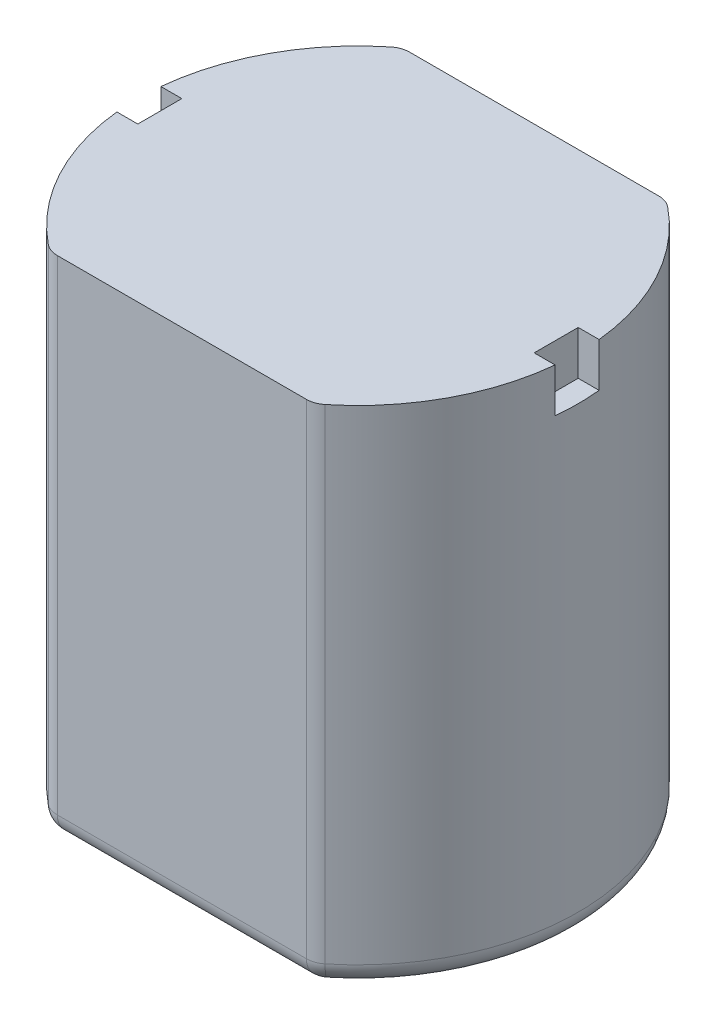
ISO-10303-21;
HEADER;
FILE_DESCRIPTION(('STEP AP214'),'2;1');
FILE_NAME('part.step','',(''),(''),'','','');
FILE_SCHEMA(('AUTOMOTIVE_DESIGN { 1 0 10303 214 1 1 1 1 }'));
ENDSEC;
DATA;
#1=APPLICATION_CONTEXT('core data for automotive mechanical design processes');
#2=APPLICATION_PROTOCOL_DEFINITION('international standard','automotive_design',2000,#1);
#3=PRODUCT_CONTEXT('',#1,'mechanical');
#4=PRODUCT('Part','Part','',(#3));
#5=PRODUCT_RELATED_PRODUCT_CATEGORY('part','',(#4));
#6=PRODUCT_DEFINITION_FORMATION('','',#4);
#7=PRODUCT_DEFINITION_CONTEXT('part definition',#1,'design');
#8=PRODUCT_DEFINITION('design','',#6,#7);
#9=PRODUCT_DEFINITION_SHAPE('','',#8);
#10=(LENGTH_UNIT() NAMED_UNIT(*) SI_UNIT(.MILLI.,.METRE.));
#11=(NAMED_UNIT(*) PLANE_ANGLE_UNIT() SI_UNIT($,.RADIAN.));
#12=(NAMED_UNIT(*) SI_UNIT($,.STERADIAN.) SOLID_ANGLE_UNIT());
#13=UNCERTAINTY_MEASURE_WITH_UNIT(LENGTH_MEASURE(1.E-05),#10,'distance_accuracy_value','');
#14=(GEOMETRIC_REPRESENTATION_CONTEXT(3) GLOBAL_UNCERTAINTY_ASSIGNED_CONTEXT((#13)) GLOBAL_UNIT_ASSIGNED_CONTEXT((#10,
#11,#12)) REPRESENTATION_CONTEXT('',''));
#15=CARTESIAN_POINT('',(0.,0.,0.));
#16=DIRECTION('',(0.,0.,1.));
#17=DIRECTION('',(1.,0.,0.));
#18=AXIS2_PLACEMENT_3D('',#15,#16,#17);
#19=CARTESIAN_POINT('',(-3.,0.5,0.));
#20=DIRECTION('',(0.,-1.,0.));
#21=DIRECTION('',(0.,0.,-1.));
#22=AXIS2_PLACEMENT_3D('',#19,#20,#21);
#23=PLANE('',#22);
#24=CARTESIAN_POINT('',(-3.,0.5,0.));
#25=DIRECTION('',(0.,-1.,0.));
#26=DIRECTION('',(0.,0.,-1.));
#27=AXIS2_PLACEMENT_3D('',#24,#25,#26);
#28=CIRCLE('',#27,0.376312748616978);
#29=CARTESIAN_POINT('',(-3.,0.5,-0.376312748616978));
#30=VERTEX_POINT('',#29);
#31=CARTESIAN_POINT('',(-3.,0.5,0.376312748616978));
#32=VERTEX_POINT('',#31);
#33=EDGE_CURVE('E11',#30,#32,#28,.T.);
#34=ORIENTED_EDGE('',*,*,#33,.T.);
#35=CARTESIAN_POINT('',(-3.,0.5,0.));
#36=DIRECTION('',(0.,-1.,0.));
#37=DIRECTION('',(0.,0.,-1.));
#38=AXIS2_PLACEMENT_3D('',#35,#36,#37);
#39=CIRCLE('',#38,0.376312748616978);
#40=EDGE_CURVE('E564',#32,#30,#39,.T.);
#41=ORIENTED_EDGE('',*,*,#40,.T.);
#42=EDGE_LOOP('',(#34,#41));
#43=FACE_BOUND('',#42,.T.);
#44=ADVANCED_FACE('F17',(#43),#23,.T.);
#45=CARTESIAN_POINT('',(-3.,0.5,0.));
#46=DIRECTION('',(0.,-1.,0.));
#47=DIRECTION('',(0.,0.,-1.));
#48=AXIS2_PLACEMENT_3D('',#45,#46,#47);
#49=CYLINDRICAL_SURFACE('',#48,0.376312748616978);
#50=DIRECTION('',(0.,-1.,0.));
#51=VECTOR('',#50,1.);
#52=CARTESIAN_POINT('',(-3.,0.5,0.376312748616978));
#53=LINE('',#52,#51);
#54=CARTESIAN_POINT('',(-3.,0.,0.376312748616978));
#55=VERTEX_POINT('',#54);
#56=EDGE_CURVE('E549',#32,#55,#53,.T.);
#57=ORIENTED_EDGE('',*,*,#56,.F.);
#58=ORIENTED_EDGE('',*,*,#33,.F.);
#59=DIRECTION('',(0.,-1.,0.));
#60=VECTOR('',#59,1.);
#61=CARTESIAN_POINT('',(-3.,0.5,-0.376312748616978));
#62=LINE('',#61,#60);
#63=CARTESIAN_POINT('',(-3.,0.,-0.376312748616978));
#64=VERTEX_POINT('',#63);
#65=EDGE_CURVE('E529',#30,#64,#62,.T.);
#66=ORIENTED_EDGE('',*,*,#65,.T.);
#67=CARTESIAN_POINT('',(-3.,0.,0.));
#68=DIRECTION('',(0.,-1.,0.));
#69=DIRECTION('',(0.,0.,-1.));
#70=AXIS2_PLACEMENT_3D('',#67,#68,#69);
#71=CIRCLE('',#70,0.376312748616978);
#72=EDGE_CURVE('E435',#64,#55,#71,.T.);
#73=ORIENTED_EDGE('',*,*,#72,.T.);
#74=EDGE_LOOP('',(#57,#58,#66,#73));
#75=FACE_BOUND('',#74,.T.);
#76=ADVANCED_FACE('F606',(#75),#49,.F.);
#77=CARTESIAN_POINT('',(3.,0.5,0.));
#78=DIRECTION('',(0.,-1.,0.));
#79=DIRECTION('',(0.,0.,-1.));
#80=AXIS2_PLACEMENT_3D('',#77,#78,#79);
#81=PLANE('',#80);
#82=CARTESIAN_POINT('',(3.,0.5,0.));
#83=DIRECTION('',(0.,-1.,0.));
#84=DIRECTION('',(0.,0.,-1.));
#85=AXIS2_PLACEMENT_3D('',#82,#83,#84);
#86=CIRCLE('',#85,0.431953984557101);
#87=CARTESIAN_POINT('',(3.,0.5,-0.431953984557101));
#88=VERTEX_POINT('',#87);
#89=CARTESIAN_POINT('',(3.,0.5,0.431953984557101));
#90=VERTEX_POINT('',#89);
#91=EDGE_CURVE('E25',#88,#90,#86,.T.);
#92=ORIENTED_EDGE('',*,*,#91,.T.);
#93=CARTESIAN_POINT('',(3.,0.5,0.));
#94=DIRECTION('',(0.,-1.,0.));
#95=DIRECTION('',(0.,0.,-1.));
#96=AXIS2_PLACEMENT_3D('',#93,#94,#95);
#97=CIRCLE('',#96,0.431953984557101);
#98=EDGE_CURVE('E515',#90,#88,#97,.T.);
#99=ORIENTED_EDGE('',*,*,#98,.T.);
#100=EDGE_LOOP('',(#92,#99));
#101=FACE_BOUND('',#100,.T.);
#102=ADVANCED_FACE('F513',(#101),#81,.T.);
#103=CARTESIAN_POINT('',(3.,0.5,0.));
#104=DIRECTION('',(0.,-1.,0.));
#105=DIRECTION('',(0.,0.,-1.));
#106=AXIS2_PLACEMENT_3D('',#103,#104,#105);
#107=CYLINDRICAL_SURFACE('',#106,0.431953984557101);
#108=DIRECTION('',(0.,-1.,0.));
#109=VECTOR('',#108,1.);
#110=CARTESIAN_POINT('',(3.,0.5,0.431953984557101));
#111=LINE('',#110,#109);
#112=CARTESIAN_POINT('',(3.,0.,0.431953984557101));
#113=VERTEX_POINT('',#112);
#114=EDGE_CURVE('E520',#90,#113,#111,.T.);
#115=ORIENTED_EDGE('',*,*,#114,.F.);
#116=ORIENTED_EDGE('',*,*,#91,.F.);
#117=DIRECTION('',(0.,-1.,0.));
#118=VECTOR('',#117,1.);
#119=CARTESIAN_POINT('',(3.,0.5,-0.431953984557101));
#120=LINE('',#119,#118);
#121=CARTESIAN_POINT('',(3.,0.,-0.431953984557101));
#122=VERTEX_POINT('',#121);
#123=EDGE_CURVE('E298',#88,#122,#120,.T.);
#124=ORIENTED_EDGE('',*,*,#123,.T.);
#125=CARTESIAN_POINT('',(3.,0.,0.));
#126=DIRECTION('',(0.,-1.,0.));
#127=DIRECTION('',(0.,0.,-1.));
#128=AXIS2_PLACEMENT_3D('',#125,#126,#127);
#129=CIRCLE('',#128,0.431953984557101);
#130=EDGE_CURVE('E438',#122,#113,#129,.T.);
#131=ORIENTED_EDGE('',*,*,#130,.T.);
#132=EDGE_LOOP('',(#115,#116,#124,#131));
#133=FACE_BOUND('',#132,.T.);
#134=ADVANCED_FACE('F521',(#133),#107,.F.);
#135=CARTESIAN_POINT('',(0.,-2.75,0.));
#136=DIRECTION('',(0.,-1.,0.));
#137=DIRECTION('',(0.,0.,-1.));
#138=AXIS2_PLACEMENT_3D('',#135,#136,#137);
#139=PLANE('',#138);
#140=CARTESIAN_POINT('',(0.,-2.75,0.));
#141=DIRECTION('',(0.,-1.,0.));
#142=DIRECTION('',(0.,0.,-1.));
#143=AXIS2_PLACEMENT_3D('',#140,#141,#142);
#144=CIRCLE('',#143,0.25);
#145=CARTESIAN_POINT('',(0.,-2.75,0.25));
#146=VERTEX_POINT('',#145);
#147=CARTESIAN_POINT('',(0.,-2.75,-0.25));
#148=VERTEX_POINT('',#147);
#149=EDGE_CURVE('E505',#146,#148,#144,.T.);
#150=ORIENTED_EDGE('',*,*,#149,.T.);
#151=CARTESIAN_POINT('',(0.,-2.75,0.));
#152=DIRECTION('',(0.,-1.,0.));
#153=DIRECTION('',(0.,0.,-1.));
#154=AXIS2_PLACEMENT_3D('',#151,#152,#153);
#155=CIRCLE('',#154,0.25);
#156=EDGE_CURVE('E293',#148,#146,#155,.T.);
#157=ORIENTED_EDGE('',*,*,#156,.T.);
#158=EDGE_LOOP('',(#150,#157));
#159=FACE_BOUND('',#158,.T.);
#160=ADVANCED_FACE('F602',(#159),#139,.T.);
#161=CARTESIAN_POINT('',(0.,-2.75,0.));
#162=DIRECTION('',(0.,1.,0.));
#163=DIRECTION('',(0.,0.,1.));
#164=AXIS2_PLACEMENT_3D('',#161,#162,#163);
#165=CYLINDRICAL_SURFACE('',#164,0.25);
#166=DIRECTION('',(0.,1.,0.));
#167=VECTOR('',#166,1.);
#168=CARTESIAN_POINT('',(0.,-2.75,-0.25));
#169=LINE('',#168,#167);
#170=CARTESIAN_POINT('',(0.,-0.25,-0.25));
#171=VERTEX_POINT('',#170);
#172=EDGE_CURVE('E297',#148,#171,#169,.T.);
#173=ORIENTED_EDGE('',*,*,#172,.F.);
#174=ORIENTED_EDGE('',*,*,#149,.F.);
#175=DIRECTION('',(0.,1.,0.));
#176=VECTOR('',#175,1.);
#177=CARTESIAN_POINT('',(0.,-2.75,0.25));
#178=LINE('',#177,#176);
#179=CARTESIAN_POINT('',(0.,-0.25,0.25));
#180=VERTEX_POINT('',#179);
#181=EDGE_CURVE('E543',#146,#180,#178,.T.);
#182=ORIENTED_EDGE('',*,*,#181,.T.);
#183=CARTESIAN_POINT('',(0.,-0.25,0.));
#184=DIRECTION('',(0.,-1.,0.));
#185=DIRECTION('',(0.,0.,-1.));
#186=AXIS2_PLACEMENT_3D('',#183,#184,#185);
#187=CIRCLE('',#186,0.25);
#188=EDGE_CURVE('E502',#180,#171,#187,.T.);
#189=ORIENTED_EDGE('',*,*,#188,.T.);
#190=EDGE_LOOP('',(#173,#174,#182,#189));
#191=FACE_BOUND('',#190,.T.);
#192=ADVANCED_FACE('F591',(#191),#165,.T.);
#193=CARTESIAN_POINT('',(0.,-0.25,0.));
#194=DIRECTION('',(0.,-1.,0.));
#195=DIRECTION('',(0.,0.,-1.));
#196=AXIS2_PLACEMENT_3D('',#193,#194,#195);
#197=PLANE('',#196);
#198=ORIENTED_EDGE('',*,*,#188,.F.);
#199=CARTESIAN_POINT('',(0.,-0.25,0.));
#200=DIRECTION('',(0.,-1.,0.));
#201=DIRECTION('',(0.,0.,-1.));
#202=AXIS2_PLACEMENT_3D('',#199,#200,#201);
#203=CIRCLE('',#202,0.25);
#204=EDGE_CURVE('E302',#171,#180,#203,.T.);
#205=ORIENTED_EDGE('',*,*,#204,.F.);
#206=EDGE_LOOP('',(#198,#205));
#207=FACE_BOUND('',#206,.T.);
#208=CARTESIAN_POINT('',(0.,-0.25,0.));
#209=DIRECTION('',(0.,-1.,0.));
#210=DIRECTION('',(0.,0.,-1.));
#211=AXIS2_PLACEMENT_3D('',#208,#209,#210);
#212=CIRCLE('',#211,2.);
#213=CARTESIAN_POINT('',(0.,-0.25,2.));
#214=VERTEX_POINT('',#213);
#215=CARTESIAN_POINT('',(0.,-0.25,-2.));
#216=VERTEX_POINT('',#215);
#217=EDGE_CURVE('E499',#214,#216,#212,.T.);
#218=ORIENTED_EDGE('',*,*,#217,.T.);
#219=CARTESIAN_POINT('',(0.,-0.25,0.));
#220=DIRECTION('',(0.,-1.,0.));
#221=DIRECTION('',(0.,0.,-1.));
#222=AXIS2_PLACEMENT_3D('',#219,#220,#221);
#223=CIRCLE('',#222,2.);
#224=EDGE_CURVE('E322',#216,#214,#223,.T.);
#225=ORIENTED_EDGE('',*,*,#224,.T.);
#226=EDGE_LOOP('',(#218,#225));
#227=FACE_BOUND('',#226,.T.);
#228=ADVANCED_FACE('F589',(#207,#227),#197,.T.);
#229=CARTESIAN_POINT('',(0.,-0.25,0.));
#230=DIRECTION('',(0.,1.,0.));
#231=DIRECTION('',(0.,0.,1.));
#232=AXIS2_PLACEMENT_3D('',#229,#230,#231);
#233=CYLINDRICAL_SURFACE('',#232,2.);
#234=DIRECTION('',(0.,1.,0.));
#235=VECTOR('',#234,1.);
#236=CARTESIAN_POINT('',(0.,-0.25,-2.));
#237=LINE('',#236,#235);
#238=CARTESIAN_POINT('',(0.,0.,-2.));
#239=VERTEX_POINT('',#238);
#240=EDGE_CURVE('E317',#216,#239,#237,.T.);
#241=ORIENTED_EDGE('',*,*,#240,.F.);
#242=ORIENTED_EDGE('',*,*,#217,.F.);
#243=DIRECTION('',(0.,1.,0.));
#244=VECTOR('',#243,1.);
#245=CARTESIAN_POINT('',(0.,-0.25,2.));
#246=LINE('',#245,#244);
#247=CARTESIAN_POINT('',(0.,0.,2.));
#248=VERTEX_POINT('',#247);
#249=EDGE_CURVE('E332',#214,#248,#246,.T.);
#250=ORIENTED_EDGE('',*,*,#249,.T.);
#251=CARTESIAN_POINT('',(0.,0.,0.));
#252=DIRECTION('',(0.,-1.,0.));
#253=DIRECTION('',(0.,0.,1.));
#254=AXIS2_PLACEMENT_3D('',#251,#252,#253);
#255=CIRCLE('',#254,2.);
#256=EDGE_CURVE('E441',#248,#239,#255,.T.);
#257=ORIENTED_EDGE('',*,*,#256,.T.);
#258=EDGE_LOOP('',(#241,#242,#250,#257));
#259=FACE_BOUND('',#258,.T.);
#260=ADVANCED_FACE('F587',(#259),#233,.T.);
#261=CARTESIAN_POINT('',(-2.82842712474619,0.5,3.5));
#262=DIRECTION('',(1.,0.,0.));
#263=DIRECTION('',(0.,0.,1.));
#264=AXIS2_PLACEMENT_3D('',#261,#262,#263);
#265=SPHERICAL_SURFACE('',#264,0.5);
#266=CARTESIAN_POINT('',(-2.82842712474619,0.5,3.5));
#267=DIRECTION('',(-1.,0.,0.));
#268=DIRECTION('',(0.,0.,1.));
#269=AXIS2_PLACEMENT_3D('',#266,#267,#268);
#270=CIRCLE('',#269,0.5);
#271=CARTESIAN_POINT('',(-2.82842712474619,0.,3.5));
#272=VERTEX_POINT('',#271);
#273=CARTESIAN_POINT('',(-2.82842712474619,0.5,4.));
#274=VERTEX_POINT('',#273);
#275=EDGE_CURVE('E480',#272,#274,#270,.T.);
#276=ORIENTED_EDGE('',*,*,#275,.T.);
#277=CARTESIAN_POINT('',(-2.82842712474619,0.5,3.5));
#278=DIRECTION('',(0.,1.,0.));
#279=DIRECTION('',(0.,0.,-1.));
#280=AXIS2_PLACEMENT_3D('',#277,#278,#279);
#281=CIRCLE('',#280,0.5);
#282=CARTESIAN_POINT('',(-3.14269680527354,0.5,3.88888888888889));
#283=VERTEX_POINT('',#282);
#284=EDGE_CURVE('E479',#283,#274,#281,.T.);
#285=ORIENTED_EDGE('',*,*,#284,.F.);
#286=CARTESIAN_POINT('',(-2.82842712474619,0.5,3.5));
#287=DIRECTION('',(0.777777777777778,0.,0.628539361054709));
#288=DIRECTION('',(0.628539361054709,0.,-0.777777777777778));
#289=AXIS2_PLACEMENT_3D('',#286,#287,#288);
#290=CIRCLE('',#289,0.5);
#291=EDGE_CURVE('E483',#283,#272,#290,.T.);
#292=ORIENTED_EDGE('',*,*,#291,.T.);
#293=EDGE_LOOP('',(#276,#285,#292));
#294=FACE_BOUND('',#293,.T.);
#295=ADVANCED_FACE('F599',(#294),#265,.T.);
#296=CARTESIAN_POINT('',(0.,0.5,0.));
#297=DIRECTION('',(0.,1.,0.));
#298=DIRECTION('',(0.,0.,1.));
#299=AXIS2_PLACEMENT_3D('',#296,#297,#298);
#300=TOROIDAL_SURFACE('',#299,4.5,0.5);
#301=CARTESIAN_POINT('',(-2.82842712474619,0.5,-3.5));
#302=DIRECTION('',(-0.777777777777778,0.,0.628539361054709));
#303=DIRECTION('',(0.628539361054709,0.,0.777777777777778));
#304=AXIS2_PLACEMENT_3D('',#301,#302,#303);
#305=CIRCLE('',#304,0.5);
#306=CARTESIAN_POINT('',(-3.14269680527354,0.5,-3.88888888888889));
#307=VERTEX_POINT('',#306);
#308=CARTESIAN_POINT('',(-2.82842712474619,0.,-3.5));
#309=VERTEX_POINT('',#308);
#310=EDGE_CURVE('E484',#307,#309,#305,.T.);
#311=ORIENTED_EDGE('',*,*,#310,.T.);
#312=CARTESIAN_POINT('',(0.,0.,0.));
#313=DIRECTION('',(0.,-1.,0.));
#314=DIRECTION('',(0.,0.,1.));
#315=AXIS2_PLACEMENT_3D('',#312,#313,#314);
#316=CIRCLE('',#315,4.5);
#317=EDGE_CURVE('E365',#272,#309,#316,.T.);
#318=ORIENTED_EDGE('',*,*,#317,.F.);
#319=ORIENTED_EDGE('',*,*,#291,.F.);
#320=CARTESIAN_POINT('',(0.,0.5,0.));
#321=DIRECTION('',(0.,1.,0.));
#322=DIRECTION('',(0.,0.,1.));
#323=AXIS2_PLACEMENT_3D('',#320,#321,#322);
#324=CIRCLE('',#323,5.);
#325=EDGE_CURVE('E331',#307,#283,#324,.T.);
#326=ORIENTED_EDGE('',*,*,#325,.F.);
#327=EDGE_LOOP('',(#311,#318,#319,#326));
#328=FACE_BOUND('',#327,.T.);
#329=ADVANCED_FACE('F642',(#328),#300,.T.);
#330=CARTESIAN_POINT('',(-3.,0.5,3.5));
#331=DIRECTION('',(1.,0.,0.));
#332=DIRECTION('',(0.,0.,-1.));
#333=AXIS2_PLACEMENT_3D('',#330,#331,#332);
#334=CYLINDRICAL_SURFACE('',#333,0.5);
#335=CARTESIAN_POINT('',(2.82842712474619,0.5,3.5));
#336=DIRECTION('',(-1.,0.,0.));
#337=DIRECTION('',(0.,0.,1.));
#338=AXIS2_PLACEMENT_3D('',#335,#336,#337);
#339=CIRCLE('',#338,0.5);
#340=CARTESIAN_POINT('',(2.82842712474619,0.,3.5));
#341=VERTEX_POINT('',#340);
#342=CARTESIAN_POINT('',(2.82842712474619,0.5,4.));
#343=VERTEX_POINT('',#342);
#344=EDGE_CURVE('E475',#341,#343,#339,.T.);
#345=ORIENTED_EDGE('',*,*,#344,.T.);
#346=DIRECTION('',(1.,0.,0.));
#347=VECTOR('',#346,1.);
#348=CARTESIAN_POINT('',(-3.,0.5,4.));
#349=LINE('',#348,#347);
#350=EDGE_CURVE('E356',#274,#343,#349,.T.);
#351=ORIENTED_EDGE('',*,*,#350,.F.);
#352=ORIENTED_EDGE('',*,*,#275,.F.);
#353=DIRECTION('',(-1.,0.,0.));
#354=VECTOR('',#353,1.);
#355=CARTESIAN_POINT('',(0.,0.,3.5));
#356=LINE('',#355,#354);
#357=EDGE_CURVE('E312',#341,#272,#356,.T.);
#358=ORIENTED_EDGE('',*,*,#357,.F.);
#359=EDGE_LOOP('',(#345,#351,#352,#358));
#360=FACE_BOUND('',#359,.T.);
#361=ADVANCED_FACE('F636',(#360),#334,.T.);
#362=CARTESIAN_POINT('',(-2.82842712474619,0.5,-3.5));
#363=DIRECTION('',(1.,0.,0.));
#364=DIRECTION('',(0.,0.,1.));
#365=AXIS2_PLACEMENT_3D('',#362,#363,#364);
#366=SPHERICAL_SURFACE('',#365,0.5);
#367=CARTESIAN_POINT('',(-2.82842712474619,0.5,-3.5));
#368=DIRECTION('',(0.,1.,0.));
#369=DIRECTION('',(0.,0.,-1.));
#370=AXIS2_PLACEMENT_3D('',#367,#368,#369);
#371=CIRCLE('',#370,0.5);
#372=CARTESIAN_POINT('',(-2.82842712474619,0.5,-4.));
#373=VERTEX_POINT('',#372);
#374=EDGE_CURVE('E362',#373,#307,#371,.T.);
#375=ORIENTED_EDGE('',*,*,#374,.F.);
#376=CARTESIAN_POINT('',(-2.82842712474619,0.5,-3.5));
#377=DIRECTION('',(-1.,0.,0.));
#378=DIRECTION('',(0.,0.,1.));
#379=AXIS2_PLACEMENT_3D('',#376,#377,#378);
#380=CIRCLE('',#379,0.5);
#381=EDGE_CURVE('E471',#373,#309,#380,.T.);
#382=ORIENTED_EDGE('',*,*,#381,.T.);
#383=ORIENTED_EDGE('',*,*,#310,.F.);
#384=EDGE_LOOP('',(#375,#382,#383));
#385=FACE_BOUND('',#384,.T.);
#386=ADVANCED_FACE('F646',(#385),#366,.T.);
#387=CARTESIAN_POINT('',(2.82842712474619,0.5,3.5));
#388=DIRECTION('',(1.,0.,0.));
#389=DIRECTION('',(0.,0.,1.));
#390=AXIS2_PLACEMENT_3D('',#387,#388,#389);
#391=SPHERICAL_SURFACE('',#390,0.5);
#392=CARTESIAN_POINT('',(2.82842712474619,0.5,3.5));
#393=DIRECTION('',(-0.777777777777778,0.,0.628539361054709));
#394=DIRECTION('',(0.628539361054709,0.,0.777777777777778));
#395=AXIS2_PLACEMENT_3D('',#392,#393,#394);
#396=CIRCLE('',#395,0.5);
#397=CARTESIAN_POINT('',(3.14269680527354,0.5,3.88888888888889));
#398=VERTEX_POINT('',#397);
#399=EDGE_CURVE('E306',#341,#398,#396,.T.);
#400=ORIENTED_EDGE('',*,*,#399,.T.);
#401=CARTESIAN_POINT('',(2.82842712474619,0.5,3.5));
#402=DIRECTION('',(0.,1.,0.));
#403=DIRECTION('',(0.,0.,-1.));
#404=AXIS2_PLACEMENT_3D('',#401,#402,#403);
#405=CIRCLE('',#404,0.5);
#406=EDGE_CURVE('E424',#343,#398,#405,.T.);
#407=ORIENTED_EDGE('',*,*,#406,.F.);
#408=ORIENTED_EDGE('',*,*,#344,.F.);
#409=EDGE_LOOP('',(#400,#407,#408));
#410=FACE_BOUND('',#409,.T.);
#411=ADVANCED_FACE('F661',(#410),#391,.T.);
#412=CARTESIAN_POINT('',(0.,0.5,-3.5));
#413=DIRECTION('',(-1.,0.,0.));
#414=DIRECTION('',(0.,0.,1.));
#415=AXIS2_PLACEMENT_3D('',#412,#413,#414);
#416=CYLINDRICAL_SURFACE('',#415,0.5);
#417=CARTESIAN_POINT('',(2.82842712474619,0.5,-3.5));
#418=DIRECTION('',(-1.,0.,0.));
#419=DIRECTION('',(0.,0.,1.));
#420=AXIS2_PLACEMENT_3D('',#417,#418,#419);
#421=CIRCLE('',#420,0.5);
#422=CARTESIAN_POINT('',(2.82842712474619,0.5,-4.));
#423=VERTEX_POINT('',#422);
#424=CARTESIAN_POINT('',(2.82842712474619,0.,-3.5));
#425=VERTEX_POINT('',#424);
#426=EDGE_CURVE('E307',#423,#425,#421,.T.);
#427=ORIENTED_EDGE('',*,*,#426,.T.);
#428=DIRECTION('',(1.,0.,0.));
#429=VECTOR('',#428,1.);
#430=CARTESIAN_POINT('',(2.82842712474619,0.,-3.5));
#431=LINE('',#430,#429);
#432=EDGE_CURVE('E431',#309,#425,#431,.T.);
#433=ORIENTED_EDGE('',*,*,#432,.F.);
#434=ORIENTED_EDGE('',*,*,#381,.F.);
#435=DIRECTION('',(-1.,0.,0.));
#436=VECTOR('',#435,1.);
#437=CARTESIAN_POINT('',(-2.82842712474619,0.5,-4.));
#438=LINE('',#437,#436);
#439=EDGE_CURVE('E258',#423,#373,#438,.T.);
#440=ORIENTED_EDGE('',*,*,#439,.F.);
#441=EDGE_LOOP('',(#427,#433,#434,#440));
#442=FACE_BOUND('',#441,.T.);
#443=ADVANCED_FACE('F648',(#442),#416,.T.);
#444=CARTESIAN_POINT('',(0.,0.5,0.));
#445=DIRECTION('',(0.,1.,0.));
#446=DIRECTION('',(0.,0.,1.));
#447=AXIS2_PLACEMENT_3D('',#444,#445,#446);
#448=TOROIDAL_SURFACE('',#447,4.5,0.5);
#449=CARTESIAN_POINT('',(2.82842712474619,0.5,-3.5));
#450=DIRECTION('',(0.777777777777778,0.,0.628539361054709));
#451=DIRECTION('',(0.628539361054709,0.,-0.777777777777778));
#452=AXIS2_PLACEMENT_3D('',#449,#450,#451);
#453=CIRCLE('',#452,0.5);
#454=CARTESIAN_POINT('',(3.14269680527354,0.5,-3.88888888888889));
#455=VERTEX_POINT('',#454);
#456=EDGE_CURVE('E303',#425,#455,#453,.T.);
#457=ORIENTED_EDGE('',*,*,#456,.T.);
#458=CARTESIAN_POINT('',(0.,0.5,0.));
#459=DIRECTION('',(0.,1.,0.));
#460=DIRECTION('',(0.,0.,1.));
#461=AXIS2_PLACEMENT_3D('',#458,#459,#460);
#462=CIRCLE('',#461,5.);
#463=EDGE_CURVE('E409',#398,#455,#462,.T.);
#464=ORIENTED_EDGE('',*,*,#463,.F.);
#465=ORIENTED_EDGE('',*,*,#399,.F.);
#466=CARTESIAN_POINT('',(0.,0.,0.));
#467=DIRECTION('',(0.,-1.,0.));
#468=DIRECTION('',(0.,0.,1.));
#469=AXIS2_PLACEMENT_3D('',#466,#467,#468);
#470=CIRCLE('',#469,4.5);
#471=EDGE_CURVE('E308',#425,#341,#470,.T.);
#472=ORIENTED_EDGE('',*,*,#471,.F.);
#473=EDGE_LOOP('',(#457,#464,#465,#472));
#474=FACE_BOUND('',#473,.T.);
#475=ADVANCED_FACE('F629',(#474),#448,.T.);
#476=CARTESIAN_POINT('',(2.82842712474619,0.5,-3.5));
#477=DIRECTION('',(1.,0.,0.));
#478=DIRECTION('',(0.,0.,1.));
#479=AXIS2_PLACEMENT_3D('',#476,#477,#478);
#480=SPHERICAL_SURFACE('',#479,0.5);
#481=ORIENTED_EDGE('',*,*,#426,.F.);
#482=CARTESIAN_POINT('',(2.82842712474619,0.5,-3.5));
#483=DIRECTION('',(0.,1.,0.));
#484=DIRECTION('',(0.,0.,-1.));
#485=AXIS2_PLACEMENT_3D('',#482,#483,#484);
#486=CIRCLE('',#485,0.5);
#487=EDGE_CURVE('E444',#455,#423,#486,.T.);
#488=ORIENTED_EDGE('',*,*,#487,.F.);
#489=ORIENTED_EDGE('',*,*,#456,.F.);
#490=EDGE_LOOP('',(#481,#488,#489));
#491=FACE_BOUND('',#490,.T.);
#492=ADVANCED_FACE('F650',(#491),#480,.T.);
#493=CARTESIAN_POINT('',(2.82842712474619,11.5,3.5));
#494=DIRECTION('',(0.,-1.,0.));
#495=DIRECTION('',(0.,0.,-1.));
#496=AXIS2_PLACEMENT_3D('',#493,#494,#495);
#497=CYLINDRICAL_SURFACE('',#496,0.5);
#498=DIRECTION('',(0.,1.,0.));
#499=VECTOR('',#498,1.);
#500=CARTESIAN_POINT('',(2.82842712474619,11.5,4.));
#501=LINE('',#500,#499);
#502=CARTESIAN_POINT('',(2.82842712474619,11.5,4.));
#503=VERTEX_POINT('',#502);
#504=EDGE_CURVE('E352',#343,#503,#501,.T.);
#505=ORIENTED_EDGE('',*,*,#504,.F.);
#506=ORIENTED_EDGE('',*,*,#406,.T.);
#507=DIRECTION('',(0.,-1.,0.));
#508=VECTOR('',#507,1.);
#509=CARTESIAN_POINT('',(3.14269680527354,11.5,3.88888888888889));
#510=LINE('',#509,#508);
#511=CARTESIAN_POINT('',(3.14269680527354,11.5,3.88888888888889));
#512=VERTEX_POINT('',#511);
#513=EDGE_CURVE('E355',#512,#398,#510,.T.);
#514=ORIENTED_EDGE('',*,*,#513,.F.);
#515=CARTESIAN_POINT('',(2.82842712474619,11.5,3.5));
#516=DIRECTION('',(0.,1.,0.));
#517=DIRECTION('',(0.,0.,1.));
#518=AXIS2_PLACEMENT_3D('',#515,#516,#517);
#519=CIRCLE('',#518,0.5);
#520=EDGE_CURVE('E323',#503,#512,#519,.T.);
#521=ORIENTED_EDGE('',*,*,#520,.F.);
#522=EDGE_LOOP('',(#505,#506,#514,#521));
#523=FACE_BOUND('',#522,.T.);
#524=ADVANCED_FACE('F660',(#523),#497,.T.);
#525=CARTESIAN_POINT('',(-2.82842712474619,11.5,3.5));
#526=DIRECTION('',(0.,-1.,0.));
#527=DIRECTION('',(0.,0.,-1.));
#528=AXIS2_PLACEMENT_3D('',#525,#526,#527);
#529=CYLINDRICAL_SURFACE('',#528,0.5);
#530=DIRECTION('',(0.,1.,0.));
#531=VECTOR('',#530,1.);
#532=CARTESIAN_POINT('',(-3.14269680527354,11.5,3.88888888888889));
#533=LINE('',#532,#531);
#534=CARTESIAN_POINT('',(-3.14269680527354,11.5,3.88888888888889));
#535=VERTEX_POINT('',#534);
#536=EDGE_CURVE('E336',#283,#535,#533,.T.);
#537=ORIENTED_EDGE('',*,*,#536,.F.);
#538=ORIENTED_EDGE('',*,*,#284,.T.);
#539=DIRECTION('',(0.,-1.,0.));
#540=VECTOR('',#539,1.);
#541=CARTESIAN_POINT('',(-2.82842712474619,11.5,4.));
#542=LINE('',#541,#540);
#543=CARTESIAN_POINT('',(-2.82842712474619,11.5,4.));
#544=VERTEX_POINT('',#543);
#545=EDGE_CURVE('E262',#544,#274,#542,.T.);
#546=ORIENTED_EDGE('',*,*,#545,.F.);
#547=CARTESIAN_POINT('',(-2.82842712474619,11.5,3.5));
#548=DIRECTION('',(0.,1.,0.));
#549=DIRECTION('',(0.,0.,1.));
#550=AXIS2_PLACEMENT_3D('',#547,#548,#549);
#551=CIRCLE('',#550,0.5);
#552=EDGE_CURVE('E376',#535,#544,#551,.T.);
#553=ORIENTED_EDGE('',*,*,#552,.F.);
#554=EDGE_LOOP('',(#537,#538,#546,#553));
#555=FACE_BOUND('',#554,.T.);
#556=ADVANCED_FACE('F738',(#555),#529,.T.);
#557=CARTESIAN_POINT('',(2.82842712474619,11.5,-3.5));
#558=DIRECTION('',(0.,-1.,0.));
#559=DIRECTION('',(0.,0.,-1.));
#560=AXIS2_PLACEMENT_3D('',#557,#558,#559);
#561=CYLINDRICAL_SURFACE('',#560,0.5);
#562=DIRECTION('',(0.,1.,0.));
#563=VECTOR('',#562,1.);
#564=CARTESIAN_POINT('',(3.14269680527354,11.5,-3.88888888888889));
#565=LINE('',#564,#563);
#566=CARTESIAN_POINT('',(3.14269680527354,11.5,-3.88888888888889));
#567=VERTEX_POINT('',#566);
#568=EDGE_CURVE('E413',#455,#567,#565,.T.);
#569=ORIENTED_EDGE('',*,*,#568,.F.);
#570=ORIENTED_EDGE('',*,*,#487,.T.);
#571=DIRECTION('',(0.,-1.,0.));
#572=VECTOR('',#571,1.);
#573=CARTESIAN_POINT('',(2.82842712474619,0.,-4.));
#574=LINE('',#573,#572);
#575=CARTESIAN_POINT('',(2.82842712474619,11.5,-4.));
#576=VERTEX_POINT('',#575);
#577=EDGE_CURVE('E314',#576,#423,#574,.T.);
#578=ORIENTED_EDGE('',*,*,#577,.F.);
#579=CARTESIAN_POINT('',(2.82842712474619,11.5,-3.5));
#580=DIRECTION('',(0.,1.,0.));
#581=DIRECTION('',(0.,0.,1.));
#582=AXIS2_PLACEMENT_3D('',#579,#580,#581);
#583=CIRCLE('',#582,0.5);
#584=EDGE_CURVE('E279',#567,#576,#583,.T.);
#585=ORIENTED_EDGE('',*,*,#584,.F.);
#586=EDGE_LOOP('',(#569,#570,#578,#585));
#587=FACE_BOUND('',#586,.T.);
#588=ADVANCED_FACE('F653',(#587),#561,.T.);
#589=CARTESIAN_POINT('',(-2.82842712474619,11.5,-3.5));
#590=DIRECTION('',(0.,-1.,0.));
#591=DIRECTION('',(0.,0.,-1.));
#592=AXIS2_PLACEMENT_3D('',#589,#590,#591);
#593=CYLINDRICAL_SURFACE('',#592,0.5);
#594=DIRECTION('',(0.,1.,0.));
#595=VECTOR('',#594,1.);
#596=CARTESIAN_POINT('',(-2.82842712474619,11.5,-4.));
#597=LINE('',#596,#595);
#598=CARTESIAN_POINT('',(-2.82842712474619,11.5,-4.));
#599=VERTEX_POINT('',#598);
#600=EDGE_CURVE('E251',#373,#599,#597,.T.);
#601=ORIENTED_EDGE('',*,*,#600,.F.);
#602=ORIENTED_EDGE('',*,*,#374,.T.);
#603=DIRECTION('',(0.,-1.,0.));
#604=VECTOR('',#603,1.);
#605=CARTESIAN_POINT('',(-3.14269680527354,11.5,-3.88888888888889));
#606=LINE('',#605,#604);
#607=CARTESIAN_POINT('',(-3.14269680527354,11.5,-3.88888888888889));
#608=VERTEX_POINT('',#607);
#609=EDGE_CURVE('E268',#608,#307,#606,.T.);
#610=ORIENTED_EDGE('',*,*,#609,.F.);
#611=CARTESIAN_POINT('',(-2.82842712474619,11.5,-3.5));
#612=DIRECTION('',(0.,1.,0.));
#613=DIRECTION('',(0.,0.,1.));
#614=AXIS2_PLACEMENT_3D('',#611,#612,#613);
#615=CIRCLE('',#614,0.5);
#616=EDGE_CURVE('E265',#599,#608,#615,.T.);
#617=ORIENTED_EDGE('',*,*,#616,.F.);
#618=EDGE_LOOP('',(#601,#602,#610,#617));
#619=FACE_BOUND('',#618,.T.);
#620=ADVANCED_FACE('F266',(#619),#593,.T.);
#621=CARTESIAN_POINT('',(-4.5,0.,0.));
#622=DIRECTION('',(-1.,0.,0.));
#623=DIRECTION('',(0.,0.,1.));
#624=AXIS2_PLACEMENT_3D('',#621,#622,#623);
#625=PLANE('',#624);
#626=DIRECTION('',(0.,-1.,0.));
#627=VECTOR('',#626,1.);
#628=CARTESIAN_POINT('',(-4.5,11.5,0.5));
#629=LINE('',#628,#627);
#630=CARTESIAN_POINT('',(-4.5,11.5,0.5));
#631=VERTEX_POINT('',#630);
#632=CARTESIAN_POINT('',(-4.5,10.5,0.5));
#633=VERTEX_POINT('',#632);
#634=EDGE_CURVE('E38',#631,#633,#629,.T.);
#635=ORIENTED_EDGE('',*,*,#634,.F.);
#636=DIRECTION('',(0.,0.,1.));
#637=VECTOR('',#636,1.);
#638=CARTESIAN_POINT('',(-4.5,11.5,0.5));
#639=LINE('',#638,#637);
#640=CARTESIAN_POINT('',(-4.5,11.5,-0.5));
#641=VERTEX_POINT('',#640);
#642=EDGE_CURVE('E369',#641,#631,#639,.T.);
#643=ORIENTED_EDGE('',*,*,#642,.F.);
#644=DIRECTION('',(0.,1.,0.));
#645=VECTOR('',#644,1.);
#646=CARTESIAN_POINT('',(-4.5,11.5,-0.5));
#647=LINE('',#646,#645);
#648=CARTESIAN_POINT('',(-4.5,10.5,-0.5));
#649=VERTEX_POINT('',#648);
#650=EDGE_CURVE('E48',#649,#641,#647,.T.);
#651=ORIENTED_EDGE('',*,*,#650,.F.);
#652=DIRECTION('',(0.,0.,-1.));
#653=VECTOR('',#652,1.);
#654=CARTESIAN_POINT('',(-4.5,10.5,0.5));
#655=LINE('',#654,#653);
#656=EDGE_CURVE('E291',#633,#649,#655,.T.);
#657=ORIENTED_EDGE('',*,*,#656,.F.);
#658=EDGE_LOOP('',(#635,#643,#651,#657));
#659=FACE_BOUND('',#658,.T.);
#660=ADVANCED_FACE('F730',(#659),#625,.T.);
#661=CARTESIAN_POINT('',(-4.5,11.5,-0.5));
#662=DIRECTION('',(0.,0.,1.));
#663=DIRECTION('',(0.,-1.,0.));
#664=AXIS2_PLACEMENT_3D('',#661,#662,#663);
#665=PLANE('',#664);
#666=DIRECTION('',(0.,-1.,0.));
#667=VECTOR('',#666,1.);
#668=CARTESIAN_POINT('',(-4.9749371855331,11.5,-0.5));
#669=LINE('',#668,#667);
#670=CARTESIAN_POINT('',(-4.9749371855331,11.5,-0.5));
#671=VERTEX_POINT('',#670);
#672=CARTESIAN_POINT('',(-4.9749371855331,10.5,-0.5));
#673=VERTEX_POINT('',#672);
#674=EDGE_CURVE('E287',#671,#673,#669,.T.);
#675=ORIENTED_EDGE('',*,*,#674,.T.);
#676=DIRECTION('',(-1.,0.,0.));
#677=VECTOR('',#676,1.);
#678=CARTESIAN_POINT('',(-4.5,10.5,-0.5));
#679=LINE('',#678,#677);
#680=EDGE_CURVE('E461',#649,#673,#679,.T.);
#681=ORIENTED_EDGE('',*,*,#680,.F.);
#682=ORIENTED_EDGE('',*,*,#650,.T.);
#683=DIRECTION('',(-1.,0.,0.));
#684=VECTOR('',#683,1.);
#685=CARTESIAN_POINT('',(-4.5,11.5,-0.5));
#686=LINE('',#685,#684);
#687=EDGE_CURVE('E273',#641,#671,#686,.T.);
#688=ORIENTED_EDGE('',*,*,#687,.T.);
#689=EDGE_LOOP('',(#675,#681,#682,#688));
#690=FACE_BOUND('',#689,.T.);
#691=ADVANCED_FACE('F700',(#690),#665,.T.);
#692=CARTESIAN_POINT('',(-4.5,11.5,0.5));
#693=DIRECTION('',(0.,0.,-1.));
#694=DIRECTION('',(-1.,0.,0.));
#695=AXIS2_PLACEMENT_3D('',#692,#693,#694);
#696=PLANE('',#695);
#697=DIRECTION('',(0.,1.,0.));
#698=VECTOR('',#697,1.);
#699=CARTESIAN_POINT('',(-4.9749371855331,11.5,0.5));
#700=LINE('',#699,#698);
#701=CARTESIAN_POINT('',(-4.9749371855331,10.5,0.5));
#702=VERTEX_POINT('',#701);
#703=CARTESIAN_POINT('',(-4.9749371855331,11.5,0.5));
#704=VERTEX_POINT('',#703);
#705=EDGE_CURVE('E344',#702,#704,#700,.T.);
#706=ORIENTED_EDGE('',*,*,#705,.T.);
#707=DIRECTION('',(-1.,0.,0.));
#708=VECTOR('',#707,1.);
#709=CARTESIAN_POINT('',(-4.5,11.5,0.5));
#710=LINE('',#709,#708);
#711=EDGE_CURVE('E373',#631,#704,#710,.T.);
#712=ORIENTED_EDGE('',*,*,#711,.F.);
#713=ORIENTED_EDGE('',*,*,#634,.T.);
#714=DIRECTION('',(-1.,0.,0.));
#715=VECTOR('',#714,1.);
#716=CARTESIAN_POINT('',(-4.5,10.5,0.5));
#717=LINE('',#716,#715);
#718=EDGE_CURVE('E458',#633,#702,#717,.T.);
#719=ORIENTED_EDGE('',*,*,#718,.T.);
#720=EDGE_LOOP('',(#706,#712,#713,#719));
#721=FACE_BOUND('',#720,.T.);
#722=ADVANCED_FACE('F696',(#721),#696,.T.);
#723=CARTESIAN_POINT('',(-4.5,10.5,0.5));
#724=DIRECTION('',(0.,1.,0.));
#725=DIRECTION('',(1.,0.,0.));
#726=AXIS2_PLACEMENT_3D('',#723,#724,#725);
#727=PLANE('',#726);
#728=ORIENTED_EDGE('',*,*,#680,.T.);
#729=CARTESIAN_POINT('',(0.,10.5,0.));
#730=DIRECTION('',(0.,1.,0.));
#731=DIRECTION('',(0.,0.,1.));
#732=AXIS2_PLACEMENT_3D('',#729,#730,#731);
#733=CIRCLE('',#732,5.);
#734=EDGE_CURVE('E348',#673,#702,#733,.T.);
#735=ORIENTED_EDGE('',*,*,#734,.T.);
#736=ORIENTED_EDGE('',*,*,#718,.F.);
#737=ORIENTED_EDGE('',*,*,#656,.T.);
#738=EDGE_LOOP('',(#728,#735,#736,#737));
#739=FACE_BOUND('',#738,.T.);
#740=ADVANCED_FACE('F699',(#739),#727,.T.);
#741=CARTESIAN_POINT('',(4.5,0.,0.));
#742=DIRECTION('',(1.,0.,0.));
#743=DIRECTION('',(0.,1.,0.));
#744=AXIS2_PLACEMENT_3D('',#741,#742,#743);
#745=PLANE('',#744);
#746=DIRECTION('',(0.,-1.,0.));
#747=VECTOR('',#746,1.);
#748=CARTESIAN_POINT('',(4.5,11.5,0.5));
#749=LINE('',#748,#747);
#750=CARTESIAN_POINT('',(4.5,11.5,0.5));
#751=VERTEX_POINT('',#750);
#752=CARTESIAN_POINT('',(4.5,10.5,0.5));
#753=VERTEX_POINT('',#752);
#754=EDGE_CURVE('E457',#751,#753,#749,.T.);
#755=ORIENTED_EDGE('',*,*,#754,.T.);
#756=DIRECTION('',(0.,0.,-1.));
#757=VECTOR('',#756,1.);
#758=CARTESIAN_POINT('',(4.5,10.5,0.5));
#759=LINE('',#758,#757);
#760=CARTESIAN_POINT('',(4.5,10.5,-0.5));
#761=VERTEX_POINT('',#760);
#762=EDGE_CURVE('E450',#753,#761,#759,.T.);
#763=ORIENTED_EDGE('',*,*,#762,.T.);
#764=DIRECTION('',(0.,1.,0.));
#765=VECTOR('',#764,1.);
#766=CARTESIAN_POINT('',(4.5,11.5,-0.5));
#767=LINE('',#766,#765);
#768=CARTESIAN_POINT('',(4.5,11.5,-0.5));
#769=VERTEX_POINT('',#768);
#770=EDGE_CURVE('E464',#761,#769,#767,.T.);
#771=ORIENTED_EDGE('',*,*,#770,.T.);
#772=DIRECTION('',(0.,0.,1.));
#773=VECTOR('',#772,1.);
#774=CARTESIAN_POINT('',(4.5,11.5,0.5));
#775=LINE('',#774,#773);
#776=EDGE_CURVE('E393',#769,#751,#775,.T.);
#777=ORIENTED_EDGE('',*,*,#776,.T.);
#778=EDGE_LOOP('',(#755,#763,#771,#777));
#779=FACE_BOUND('',#778,.T.);
#780=ADVANCED_FACE('F703',(#779),#745,.T.);
#781=CARTESIAN_POINT('',(4.5,11.5,-0.5));
#782=DIRECTION('',(0.,0.,-1.));
#783=DIRECTION('',(-1.,0.,0.));
#784=AXIS2_PLACEMENT_3D('',#781,#782,#783);
#785=PLANE('',#784);
#786=DIRECTION('',(1.,0.,0.));
#787=VECTOR('',#786,1.);
#788=CARTESIAN_POINT('',(4.5,11.5,-0.5));
#789=LINE('',#788,#787);
#790=CARTESIAN_POINT('',(4.9749371855331,11.5,-0.5));
#791=VERTEX_POINT('',#790);
#792=EDGE_CURVE('E397',#769,#791,#789,.T.);
#793=ORIENTED_EDGE('',*,*,#792,.F.);
#794=ORIENTED_EDGE('',*,*,#770,.F.);
#795=DIRECTION('',(1.,0.,0.));
#796=VECTOR('',#795,1.);
#797=CARTESIAN_POINT('',(4.5,10.5,-0.5));
#798=LINE('',#797,#796);
#799=CARTESIAN_POINT('',(4.9749371855331,10.5,-0.5));
#800=VERTEX_POINT('',#799);
#801=EDGE_CURVE('E447',#761,#800,#798,.T.);
#802=ORIENTED_EDGE('',*,*,#801,.T.);
#803=DIRECTION('',(0.,-1.,0.));
#804=VECTOR('',#803,1.);
#805=CARTESIAN_POINT('',(4.9749371855331,11.5,-0.5));
#806=LINE('',#805,#804);
#807=EDGE_CURVE('E416',#791,#800,#806,.T.);
#808=ORIENTED_EDGE('',*,*,#807,.F.);
#809=EDGE_LOOP('',(#793,#794,#802,#808));
#810=FACE_BOUND('',#809,.T.);
#811=ADVANCED_FACE('F718',(#810),#785,.F.);
#812=CARTESIAN_POINT('',(4.5,11.5,0.5));
#813=DIRECTION('',(0.,0.,1.));
#814=DIRECTION('',(0.,-1.,0.));
#815=AXIS2_PLACEMENT_3D('',#812,#813,#814);
#816=PLANE('',#815);
#817=DIRECTION('',(1.,0.,0.));
#818=VECTOR('',#817,1.);
#819=CARTESIAN_POINT('',(4.5,10.5,0.5));
#820=LINE('',#819,#818);
#821=CARTESIAN_POINT('',(4.9749371855331,10.5,0.5));
#822=VERTEX_POINT('',#821);
#823=EDGE_CURVE('E454',#753,#822,#820,.T.);
#824=ORIENTED_EDGE('',*,*,#823,.F.);
#825=ORIENTED_EDGE('',*,*,#754,.F.);
#826=DIRECTION('',(1.,0.,0.));
#827=VECTOR('',#826,1.);
#828=CARTESIAN_POINT('',(4.5,11.5,0.5));
#829=LINE('',#828,#827);
#830=CARTESIAN_POINT('',(4.9749371855331,11.5,0.5));
#831=VERTEX_POINT('',#830);
#832=EDGE_CURVE('E389',#751,#831,#829,.T.);
#833=ORIENTED_EDGE('',*,*,#832,.T.);
#834=DIRECTION('',(0.,1.,0.));
#835=VECTOR('',#834,1.);
#836=CARTESIAN_POINT('',(4.9749371855331,11.5,0.5));
#837=LINE('',#836,#835);
#838=EDGE_CURVE('E313',#822,#831,#837,.T.);
#839=ORIENTED_EDGE('',*,*,#838,.F.);
#840=EDGE_LOOP('',(#824,#825,#833,#839));
#841=FACE_BOUND('',#840,.T.);
#842=ADVANCED_FACE('F723',(#841),#816,.F.);
#843=CARTESIAN_POINT('',(4.5,10.5,0.5));
#844=DIRECTION('',(0.,-1.,0.));
#845=DIRECTION('',(0.,0.,-1.));
#846=AXIS2_PLACEMENT_3D('',#843,#844,#845);
#847=PLANE('',#846);
#848=ORIENTED_EDGE('',*,*,#801,.F.);
#849=ORIENTED_EDGE('',*,*,#762,.F.);
#850=ORIENTED_EDGE('',*,*,#823,.T.);
#851=CARTESIAN_POINT('',(0.,10.5,0.));
#852=DIRECTION('',(0.,-1.,0.));
#853=DIRECTION('',(0.,0.,-1.));
#854=AXIS2_PLACEMENT_3D('',#851,#852,#853);
#855=CIRCLE('',#854,5.);
#856=EDGE_CURVE('E420',#800,#822,#855,.T.);
#857=ORIENTED_EDGE('',*,*,#856,.F.);
#858=EDGE_LOOP('',(#848,#849,#850,#857));
#859=FACE_BOUND('',#858,.T.);
#860=ADVANCED_FACE('F622',(#859),#847,.F.);
#861=CARTESIAN_POINT('',(0.,0.,0.));
#862=DIRECTION('',(0.,1.,0.));
#863=DIRECTION('',(1.,0.,0.));
#864=AXIS2_PLACEMENT_3D('',#861,#862,#863);
#865=PLANE('',#864);
#866=ORIENTED_EDGE('',*,*,#256,.F.);
#867=CARTESIAN_POINT('',(0.,0.,0.));
#868=DIRECTION('',(0.,-1.,0.));
#869=DIRECTION('',(0.,0.,1.));
#870=AXIS2_PLACEMENT_3D('',#867,#868,#869);
#871=CIRCLE('',#870,2.);
#872=EDGE_CURVE('E321',#239,#248,#871,.T.);
#873=ORIENTED_EDGE('',*,*,#872,.F.);
#874=EDGE_LOOP('',(#866,#873));
#875=FACE_BOUND('',#874,.T.);
#876=ORIENTED_EDGE('',*,*,#130,.F.);
#877=CARTESIAN_POINT('',(3.,0.,0.));
#878=DIRECTION('',(0.,-1.,0.));
#879=DIRECTION('',(0.,0.,-1.));
#880=AXIS2_PLACEMENT_3D('',#877,#878,#879);
#881=CIRCLE('',#880,0.431953984557101);
#882=EDGE_CURVE('E526',#113,#122,#881,.T.);
#883=ORIENTED_EDGE('',*,*,#882,.F.);
#884=EDGE_LOOP('',(#876,#883));
#885=FACE_BOUND('',#884,.T.);
#886=ORIENTED_EDGE('',*,*,#72,.F.);
#887=CARTESIAN_POINT('',(-3.,0.,0.));
#888=DIRECTION('',(0.,-1.,0.));
#889=DIRECTION('',(0.,0.,-1.));
#890=AXIS2_PLACEMENT_3D('',#887,#888,#889);
#891=CIRCLE('',#890,0.376312748616978);
#892=EDGE_CURVE('E535',#55,#64,#891,.T.);
#893=ORIENTED_EDGE('',*,*,#892,.F.);
#894=EDGE_LOOP('',(#886,#893));
#895=FACE_BOUND('',#894,.T.);
#896=ORIENTED_EDGE('',*,*,#471,.T.);
#897=ORIENTED_EDGE('',*,*,#357,.T.);
#898=ORIENTED_EDGE('',*,*,#317,.T.);
#899=ORIENTED_EDGE('',*,*,#432,.T.);
#900=EDGE_LOOP('',(#896,#897,#898,#899));
#901=FACE_BOUND('',#900,.T.);
#902=ADVANCED_FACE('F584',(#875,#885,#895,#901),#865,.F.);
#903=CARTESIAN_POINT('',(0.,11.5,0.));
#904=DIRECTION('',(0.,-1.,0.));
#905=DIRECTION('',(0.,0.,-1.));
#906=AXIS2_PLACEMENT_3D('',#903,#904,#905);
#907=CYLINDRICAL_SURFACE('',#906,5.);
#908=ORIENTED_EDGE('',*,*,#513,.T.);
#909=ORIENTED_EDGE('',*,*,#463,.T.);
#910=ORIENTED_EDGE('',*,*,#568,.T.);
#911=CARTESIAN_POINT('',(0.,11.5,0.));
#912=DIRECTION('',(0.,1.,0.));
#913=DIRECTION('',(0.,0.,1.));
#914=AXIS2_PLACEMENT_3D('',#911,#912,#913);
#915=CIRCLE('',#914,5.);
#916=EDGE_CURVE('E339',#791,#567,#915,.T.);
#917=ORIENTED_EDGE('',*,*,#916,.F.);
#918=ORIENTED_EDGE('',*,*,#807,.T.);
#919=ORIENTED_EDGE('',*,*,#856,.T.);
#920=ORIENTED_EDGE('',*,*,#838,.T.);
#921=CARTESIAN_POINT('',(0.,11.5,0.));
#922=DIRECTION('',(0.,1.,0.));
#923=DIRECTION('',(0.,0.,1.));
#924=AXIS2_PLACEMENT_3D('',#921,#922,#923);
#925=CIRCLE('',#924,5.);
#926=EDGE_CURVE('E327',#512,#831,#925,.T.);
#927=ORIENTED_EDGE('',*,*,#926,.F.);
#928=EDGE_LOOP('',(#908,#909,#910,#917,#918,#919,#920,#927));
#929=FACE_BOUND('',#928,.T.);
#930=ADVANCED_FACE('F621',(#929),#907,.T.);
#931=CARTESIAN_POINT('',(-3.,11.5,4.));
#932=DIRECTION('',(0.,0.,-1.));
#933=DIRECTION('',(0.,-1.,0.));
#934=AXIS2_PLACEMENT_3D('',#931,#932,#933);
#935=PLANE('',#934);
#936=ORIENTED_EDGE('',*,*,#545,.T.);
#937=ORIENTED_EDGE('',*,*,#350,.T.);
#938=ORIENTED_EDGE('',*,*,#504,.T.);
#939=DIRECTION('',(1.,0.,0.));
#940=VECTOR('',#939,1.);
#941=CARTESIAN_POINT('',(-3.,11.5,4.));
#942=LINE('',#941,#940);
#943=EDGE_CURVE('E328',#544,#503,#942,.T.);
#944=ORIENTED_EDGE('',*,*,#943,.F.);
#945=EDGE_LOOP('',(#936,#937,#938,#944));
#946=FACE_BOUND('',#945,.T.);
#947=ADVANCED_FACE('F711',(#946),#935,.F.);
#948=CARTESIAN_POINT('',(-3.,11.5,-4.));
#949=DIRECTION('',(0.,0.,-1.));
#950=DIRECTION('',(0.,-1.,0.));
#951=AXIS2_PLACEMENT_3D('',#948,#949,#950);
#952=PLANE('',#951);
#953=ORIENTED_EDGE('',*,*,#577,.T.);
#954=ORIENTED_EDGE('',*,*,#439,.T.);
#955=ORIENTED_EDGE('',*,*,#600,.T.);
#956=DIRECTION('',(1.,0.,0.));
#957=VECTOR('',#956,1.);
#958=CARTESIAN_POINT('',(-3.,11.5,-4.));
#959=LINE('',#958,#957);
#960=EDGE_CURVE('E256',#599,#576,#959,.T.);
#961=ORIENTED_EDGE('',*,*,#960,.T.);
#962=EDGE_LOOP('',(#953,#954,#955,#961));
#963=FACE_BOUND('',#962,.T.);
#964=ADVANCED_FACE('F254',(#963),#952,.T.);
#965=CARTESIAN_POINT('',(0.,11.5,0.));
#966=DIRECTION('',(0.,1.,0.));
#967=DIRECTION('',(1.,0.,0.));
#968=AXIS2_PLACEMENT_3D('',#965,#966,#967);
#969=PLANE('',#968);
#970=ORIENTED_EDGE('',*,*,#960,.F.);
#971=ORIENTED_EDGE('',*,*,#616,.T.);
#972=CARTESIAN_POINT('',(0.,11.5,0.));
#973=DIRECTION('',(0.,1.,0.));
#974=DIRECTION('',(0.,0.,1.));
#975=AXIS2_PLACEMENT_3D('',#972,#973,#974);
#976=CIRCLE('',#975,5.);
#977=EDGE_CURVE('E281',#608,#671,#976,.T.);
#978=ORIENTED_EDGE('',*,*,#977,.T.);
#979=ORIENTED_EDGE('',*,*,#687,.F.);
#980=ORIENTED_EDGE('',*,*,#642,.T.);
#981=ORIENTED_EDGE('',*,*,#711,.T.);
#982=CARTESIAN_POINT('',(0.,11.5,0.));
#983=DIRECTION('',(0.,1.,0.));
#984=DIRECTION('',(0.,0.,1.));
#985=AXIS2_PLACEMENT_3D('',#982,#983,#984);
#986=CIRCLE('',#985,5.);
#987=EDGE_CURVE('E343',#704,#535,#986,.T.);
#988=ORIENTED_EDGE('',*,*,#987,.T.);
#989=ORIENTED_EDGE('',*,*,#552,.T.);
#990=ORIENTED_EDGE('',*,*,#943,.T.);
#991=ORIENTED_EDGE('',*,*,#520,.T.);
#992=ORIENTED_EDGE('',*,*,#926,.T.);
#993=ORIENTED_EDGE('',*,*,#832,.F.);
#994=ORIENTED_EDGE('',*,*,#776,.F.);
#995=ORIENTED_EDGE('',*,*,#792,.T.);
#996=ORIENTED_EDGE('',*,*,#916,.T.);
#997=ORIENTED_EDGE('',*,*,#584,.T.);
#998=EDGE_LOOP('',(#970,#971,#978,#979,#980,#981,#988,#989,#990,#991,#992,#993,#994,#995,#996,#997));
#999=FACE_BOUND('',#998,.T.);
#1000=ADVANCED_FACE('F276',(#999),#969,.T.);
#1001=CARTESIAN_POINT('',(0.,11.5,0.));
#1002=DIRECTION('',(0.,-1.,0.));
#1003=DIRECTION('',(0.,0.,-1.));
#1004=AXIS2_PLACEMENT_3D('',#1001,#1002,#1003);
#1005=CYLINDRICAL_SURFACE('',#1004,5.);
#1006=ORIENTED_EDGE('',*,*,#609,.T.);
#1007=ORIENTED_EDGE('',*,*,#325,.T.);
#1008=ORIENTED_EDGE('',*,*,#536,.T.);
#1009=ORIENTED_EDGE('',*,*,#987,.F.);
#1010=ORIENTED_EDGE('',*,*,#705,.F.);
#1011=ORIENTED_EDGE('',*,*,#734,.F.);
#1012=ORIENTED_EDGE('',*,*,#674,.F.);
#1013=ORIENTED_EDGE('',*,*,#977,.F.);
#1014=EDGE_LOOP('',(#1006,#1007,#1008,#1009,#1010,#1011,#1012,#1013));
#1015=FACE_BOUND('',#1014,.T.);
#1016=ADVANCED_FACE('F695',(#1015),#1005,.T.);
#1017=CARTESIAN_POINT('',(0.,-0.25,0.));
#1018=DIRECTION('',(0.,1.,0.));
#1019=DIRECTION('',(0.,0.,1.));
#1020=AXIS2_PLACEMENT_3D('',#1017,#1018,#1019);
#1021=CYLINDRICAL_SURFACE('',#1020,2.);
#1022=ORIENTED_EDGE('',*,*,#224,.F.);
#1023=ORIENTED_EDGE('',*,*,#240,.T.);
#1024=ORIENTED_EDGE('',*,*,#872,.T.);
#1025=ORIENTED_EDGE('',*,*,#249,.F.);
#1026=EDGE_LOOP('',(#1022,#1023,#1024,#1025));
#1027=FACE_BOUND('',#1026,.T.);
#1028=ADVANCED_FACE('F581',(#1027),#1021,.T.);
#1029=CARTESIAN_POINT('',(0.,-2.75,0.));
#1030=DIRECTION('',(0.,1.,0.));
#1031=DIRECTION('',(0.,0.,1.));
#1032=AXIS2_PLACEMENT_3D('',#1029,#1030,#1031);
#1033=CYLINDRICAL_SURFACE('',#1032,0.25);
#1034=ORIENTED_EDGE('',*,*,#156,.F.);
#1035=ORIENTED_EDGE('',*,*,#172,.T.);
#1036=ORIENTED_EDGE('',*,*,#204,.T.);
#1037=ORIENTED_EDGE('',*,*,#181,.F.);
#1038=EDGE_LOOP('',(#1034,#1035,#1036,#1037));
#1039=FACE_BOUND('',#1038,.T.);
#1040=ADVANCED_FACE('F687',(#1039),#1033,.T.);
#1041=CARTESIAN_POINT('',(3.,0.5,0.));
#1042=DIRECTION('',(0.,-1.,0.));
#1043=DIRECTION('',(0.,0.,-1.));
#1044=AXIS2_PLACEMENT_3D('',#1041,#1042,#1043);
#1045=CYLINDRICAL_SURFACE('',#1044,0.431953984557101);
#1046=ORIENTED_EDGE('',*,*,#98,.F.);
#1047=ORIENTED_EDGE('',*,*,#114,.T.);
#1048=ORIENTED_EDGE('',*,*,#882,.T.);
#1049=ORIENTED_EDGE('',*,*,#123,.F.);
#1050=EDGE_LOOP('',(#1046,#1047,#1048,#1049));
#1051=FACE_BOUND('',#1050,.T.);
#1052=ADVANCED_FACE('F527',(#1051),#1045,.F.);
#1053=CARTESIAN_POINT('',(-3.,0.5,0.));
#1054=DIRECTION('',(0.,-1.,0.));
#1055=DIRECTION('',(0.,0.,-1.));
#1056=AXIS2_PLACEMENT_3D('',#1053,#1054,#1055);
#1057=CYLINDRICAL_SURFACE('',#1056,0.376312748616978);
#1058=ORIENTED_EDGE('',*,*,#40,.F.);
#1059=ORIENTED_EDGE('',*,*,#56,.T.);
#1060=ORIENTED_EDGE('',*,*,#892,.T.);
#1061=ORIENTED_EDGE('',*,*,#65,.F.);
#1062=EDGE_LOOP('',(#1058,#1059,#1060,#1061));
#1063=FACE_BOUND('',#1062,.T.);
#1064=ADVANCED_FACE('F617',(#1063),#1057,.F.);
#1065=CLOSED_SHELL('',(#44,#76,#102,#134,#160,#192,#228,#260,#295,#329,#361,#386,#411,#443,#475,
#492,#524,#556,#588,#620,#660,#691,#722,#740,#780,#811,#842,#860,#902,#930,#947,#964,#1000,
#1016,#1028,#1040,#1052,#1064));
#1066=MANIFOLD_SOLID_BREP('B1',#1065);
#1067=ADVANCED_BREP_SHAPE_REPRESENTATION('',(#18,#1066),#14);
#1068=SHAPE_DEFINITION_REPRESENTATION(#9,#1067);
ENDSEC;
END-ISO-10303-21;
